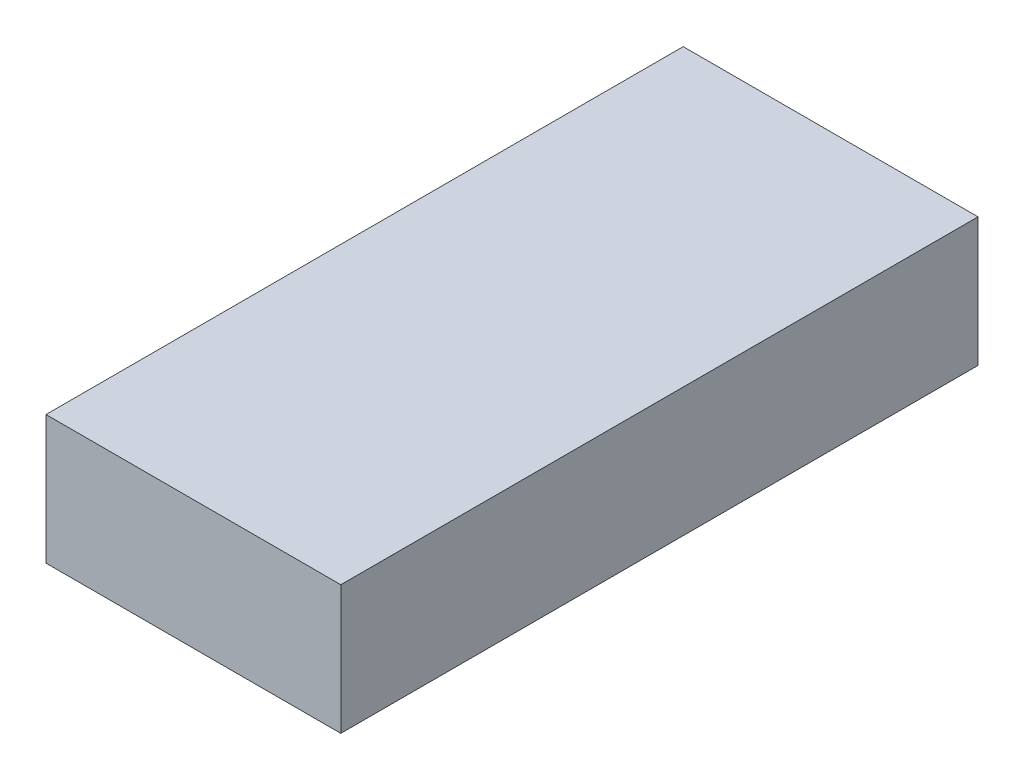
ISO-10303-21;
HEADER;
FILE_DESCRIPTION(('STEP AP214'),'2;1');
FILE_NAME('part.step','',(''),(''),'','','');
FILE_SCHEMA(('AUTOMOTIVE_DESIGN { 1 0 10303 214 1 1 1 1 }'));
ENDSEC;
DATA;
#1=APPLICATION_CONTEXT('core data for automotive mechanical design processes');
#2=APPLICATION_PROTOCOL_DEFINITION('international standard','automotive_design',2000,#1);
#3=PRODUCT_CONTEXT('',#1,'mechanical');
#4=PRODUCT('Part','Part','',(#3));
#5=PRODUCT_RELATED_PRODUCT_CATEGORY('part','',(#4));
#6=PRODUCT_DEFINITION_FORMATION('','',#4);
#7=PRODUCT_DEFINITION_CONTEXT('part definition',#1,'design');
#8=PRODUCT_DEFINITION('design','',#6,#7);
#9=PRODUCT_DEFINITION_SHAPE('','',#8);
#10=(LENGTH_UNIT() NAMED_UNIT(*) SI_UNIT(.MILLI.,.METRE.));
#11=(NAMED_UNIT(*) PLANE_ANGLE_UNIT() SI_UNIT($,.RADIAN.));
#12=(NAMED_UNIT(*) SI_UNIT($,.STERADIAN.) SOLID_ANGLE_UNIT());
#13=UNCERTAINTY_MEASURE_WITH_UNIT(LENGTH_MEASURE(1.E-05),#10,'distance_accuracy_value','');
#14=(GEOMETRIC_REPRESENTATION_CONTEXT(3) GLOBAL_UNCERTAINTY_ASSIGNED_CONTEXT((#13)) GLOBAL_UNIT_ASSIGNED_CONTEXT((#10,
#11,#12)) REPRESENTATION_CONTEXT('',''));
#15=CARTESIAN_POINT('',(0.,0.,0.));
#16=DIRECTION('',(0.,0.,1.));
#17=DIRECTION('',(1.,0.,0.));
#18=AXIS2_PLACEMENT_3D('',#15,#16,#17);
#19=CARTESIAN_POINT('',(-65.056444224267,10.,-33.948976923517));
#20=DIRECTION('',(1.,0.,0.));
#21=DIRECTION('',(0.,0.,-1.));
#22=AXIS2_PLACEMENT_3D('',#19,#20,#21);
#23=PLANE('',#22);
#24=DIRECTION('',(0.,0.,1.));
#25=VECTOR('',#24,1.);
#26=CARTESIAN_POINT('',(-65.056444224267,0.,-33.948976923517));
#27=LINE('',#26,#25);
#28=CARTESIAN_POINT('',(-65.056444224267,0.,-33.948976923517));
#29=VERTEX_POINT('',#28);
#30=CARTESIAN_POINT('',(-65.056444224267,0.,15.551023076483));
#31=VERTEX_POINT('',#30);
#32=EDGE_CURVE('E97',#29,#31,#27,.T.);
#33=ORIENTED_EDGE('',*,*,#32,.T.);
#34=DIRECTION('',(0.,-1.,0.));
#35=VECTOR('',#34,1.);
#36=CARTESIAN_POINT('',(-65.056444224267,10.,15.551023076483));
#37=LINE('',#36,#35);
#38=CARTESIAN_POINT('',(-65.056444224267,10.,15.551023076483));
#39=VERTEX_POINT('',#38);
#40=EDGE_CURVE('E11',#39,#31,#37,.T.);
#41=ORIENTED_EDGE('',*,*,#40,.F.);
#42=DIRECTION('',(0.,0.,1.));
#43=VECTOR('',#42,1.);
#44=CARTESIAN_POINT('',(-65.056444224267,10.,-33.948976923517));
#45=LINE('',#44,#43);
#46=CARTESIAN_POINT('',(-65.056444224267,10.,-33.948976923517));
#47=VERTEX_POINT('',#46);
#48=EDGE_CURVE('E85',#47,#39,#45,.T.);
#49=ORIENTED_EDGE('',*,*,#48,.F.);
#50=DIRECTION('',(0.,-1.,0.));
#51=VECTOR('',#50,1.);
#52=CARTESIAN_POINT('',(-65.056444224267,10.,-33.948976923517));
#53=LINE('',#52,#51);
#54=EDGE_CURVE('E93',#47,#29,#53,.T.);
#55=ORIENTED_EDGE('',*,*,#54,.T.);
#56=EDGE_LOOP('',(#33,#41,#49,#55));
#57=FACE_BOUND('',#56,.T.);
#58=ADVANCED_FACE('F34',(#57),#23,.F.);
#59=CARTESIAN_POINT('',(-65.056444224267,10.,15.551023076483));
#60=DIRECTION('',(0.,0.,-1.));
#61=DIRECTION('',(-1.,0.,0.));
#62=AXIS2_PLACEMENT_3D('',#59,#60,#61);
#63=PLANE('',#62);
#64=DIRECTION('',(1.,0.,0.));
#65=VECTOR('',#64,1.);
#66=CARTESIAN_POINT('',(-65.056444224267,0.,15.551023076483));
#67=LINE('',#66,#65);
#68=CARTESIAN_POINT('',(-42.156444224267,0.,15.551023076483));
#69=VERTEX_POINT('',#68);
#70=EDGE_CURVE('E89',#31,#69,#67,.T.);
#71=ORIENTED_EDGE('',*,*,#70,.T.);
#72=DIRECTION('',(0.,-1.,0.));
#73=VECTOR('',#72,1.);
#74=CARTESIAN_POINT('',(-42.156444224267,10.,15.551023076483));
#75=LINE('',#74,#73);
#76=CARTESIAN_POINT('',(-42.156444224267,10.,15.551023076483));
#77=VERTEX_POINT('',#76);
#78=EDGE_CURVE('E42',#77,#69,#75,.T.);
#79=ORIENTED_EDGE('',*,*,#78,.F.);
#80=DIRECTION('',(1.,0.,0.));
#81=VECTOR('',#80,1.);
#82=CARTESIAN_POINT('',(-65.056444224267,10.,15.551023076483));
#83=LINE('',#82,#81);
#84=EDGE_CURVE('E80',#39,#77,#83,.T.);
#85=ORIENTED_EDGE('',*,*,#84,.F.);
#86=ORIENTED_EDGE('',*,*,#40,.T.);
#87=EDGE_LOOP('',(#71,#79,#85,#86));
#88=FACE_BOUND('',#87,.T.);
#89=ADVANCED_FACE('F88',(#88),#63,.F.);
#90=CARTESIAN_POINT('',(-42.156444224267,10.,-33.948976923517));
#91=DIRECTION('',(-1.,0.,0.));
#92=DIRECTION('',(0.,0.,1.));
#93=AXIS2_PLACEMENT_3D('',#90,#91,#92);
#94=PLANE('',#93);
#95=DIRECTION('',(0.,0.,-1.));
#96=VECTOR('',#95,1.);
#97=CARTESIAN_POINT('',(-42.156444224267,0.,-33.948976923517));
#98=LINE('',#97,#96);
#99=CARTESIAN_POINT('',(-42.156444224267,0.,-33.948976923517));
#100=VERTEX_POINT('',#99);
#101=EDGE_CURVE('E67',#69,#100,#98,.T.);
#102=ORIENTED_EDGE('',*,*,#101,.T.);
#103=DIRECTION('',(0.,-1.,0.));
#104=VECTOR('',#103,1.);
#105=CARTESIAN_POINT('',(-42.156444224267,10.,-33.948976923517));
#106=LINE('',#105,#104);
#107=CARTESIAN_POINT('',(-42.156444224267,10.,-33.948976923517));
#108=VERTEX_POINT('',#107);
#109=EDGE_CURVE('E90',#108,#100,#106,.T.);
#110=ORIENTED_EDGE('',*,*,#109,.F.);
#111=DIRECTION('',(0.,0.,-1.));
#112=VECTOR('',#111,1.);
#113=CARTESIAN_POINT('',(-42.156444224267,10.,-33.948976923517));
#114=LINE('',#113,#112);
#115=EDGE_CURVE('E83',#77,#108,#114,.T.);
#116=ORIENTED_EDGE('',*,*,#115,.F.);
#117=ORIENTED_EDGE('',*,*,#78,.T.);
#118=EDGE_LOOP('',(#102,#110,#116,#117));
#119=FACE_BOUND('',#118,.T.);
#120=ADVANCED_FACE('F91',(#119),#94,.F.);
#121=CARTESIAN_POINT('',(-65.056444224267,10.,-33.948976923517));
#122=DIRECTION('',(0.,0.,1.));
#123=DIRECTION('',(1.,0.,0.));
#124=AXIS2_PLACEMENT_3D('',#121,#122,#123);
#125=PLANE('',#124);
#126=DIRECTION('',(-1.,0.,0.));
#127=VECTOR('',#126,1.);
#128=CARTESIAN_POINT('',(-65.056444224267,0.,-33.948976923517));
#129=LINE('',#128,#127);
#130=EDGE_CURVE('E73',#100,#29,#129,.T.);
#131=ORIENTED_EDGE('',*,*,#130,.T.);
#132=ORIENTED_EDGE('',*,*,#54,.F.);
#133=DIRECTION('',(-1.,0.,0.));
#134=VECTOR('',#133,1.);
#135=CARTESIAN_POINT('',(-65.056444224267,10.,-33.948976923517));
#136=LINE('',#135,#134);
#137=EDGE_CURVE('E50',#108,#47,#136,.T.);
#138=ORIENTED_EDGE('',*,*,#137,.F.);
#139=ORIENTED_EDGE('',*,*,#109,.T.);
#140=EDGE_LOOP('',(#131,#132,#138,#139));
#141=FACE_BOUND('',#140,.T.);
#142=ADVANCED_FACE('F104',(#141),#125,.F.);
#143=CARTESIAN_POINT('',(-65.056444224267,10.,15.551023076483));
#144=DIRECTION('',(0.,1.,0.));
#145=DIRECTION('',(0.,0.,1.));
#146=AXIS2_PLACEMENT_3D('',#143,#144,#145);
#147=PLANE('',#146);
#148=ORIENTED_EDGE('',*,*,#48,.T.);
#149=ORIENTED_EDGE('',*,*,#84,.T.);
#150=ORIENTED_EDGE('',*,*,#115,.T.);
#151=ORIENTED_EDGE('',*,*,#137,.T.);
#152=EDGE_LOOP('',(#148,#149,#150,#151));
#153=FACE_BOUND('',#152,.T.);
#154=ADVANCED_FACE('F81',(#153),#147,.T.);
#155=CARTESIAN_POINT('',(-65.056444224267,0.,15.551023076483));
#156=DIRECTION('',(0.,1.,0.));
#157=DIRECTION('',(0.,0.,1.));
#158=AXIS2_PLACEMENT_3D('',#155,#156,#157);
#159=PLANE('',#158);
#160=ORIENTED_EDGE('',*,*,#32,.F.);
#161=ORIENTED_EDGE('',*,*,#130,.F.);
#162=ORIENTED_EDGE('',*,*,#101,.F.);
#163=ORIENTED_EDGE('',*,*,#70,.F.);
#164=EDGE_LOOP('',(#160,#161,#162,#163));
#165=FACE_BOUND('',#164,.T.);
#166=ADVANCED_FACE('F107',(#165),#159,.F.);
#167=CLOSED_SHELL('',(#58,#89,#120,#142,#154,#166));
#168=MANIFOLD_SOLID_BREP('B2',#167);
#169=ADVANCED_BREP_SHAPE_REPRESENTATION('',(#18,#168),#14);
#170=SHAPE_DEFINITION_REPRESENTATION(#9,#169);
ENDSEC;
END-ISO-10303-21;
